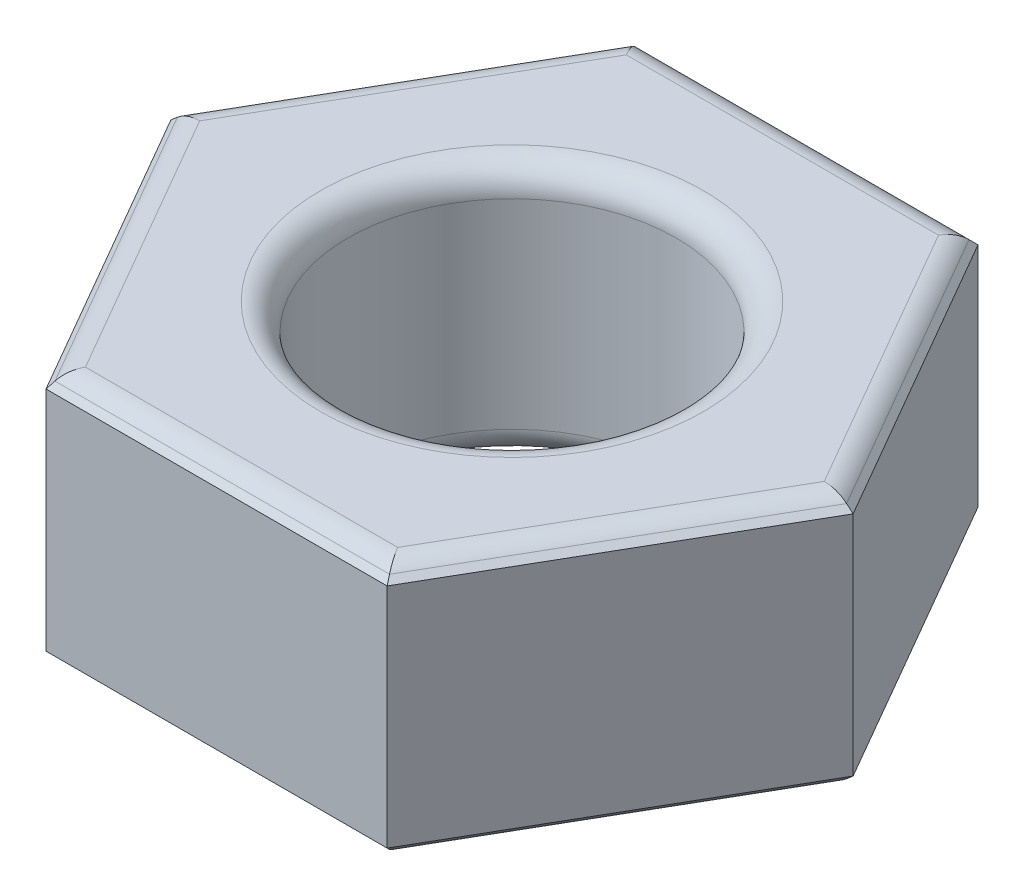
ISO-10303-21;
HEADER;
FILE_DESCRIPTION(('STEP AP214'),'2;1');
FILE_NAME('part.step','',(''),(''),'','','');
FILE_SCHEMA(('AUTOMOTIVE_DESIGN { 1 0 10303 214 1 1 1 1 }'));
ENDSEC;
DATA;
#1=APPLICATION_CONTEXT('core data for automotive mechanical design processes');
#2=APPLICATION_PROTOCOL_DEFINITION('international standard','automotive_design',2000,#1);
#3=PRODUCT_CONTEXT('',#1,'mechanical');
#4=PRODUCT('Part','Part','',(#3));
#5=PRODUCT_RELATED_PRODUCT_CATEGORY('part','',(#4));
#6=PRODUCT_DEFINITION_FORMATION('','',#4);
#7=PRODUCT_DEFINITION_CONTEXT('part definition',#1,'design');
#8=PRODUCT_DEFINITION('design','',#6,#7);
#9=PRODUCT_DEFINITION_SHAPE('','',#8);
#10=(LENGTH_UNIT() NAMED_UNIT(*) SI_UNIT(.MILLI.,.METRE.));
#11=(NAMED_UNIT(*) PLANE_ANGLE_UNIT() SI_UNIT($,.RADIAN.));
#12=(NAMED_UNIT(*) SI_UNIT($,.STERADIAN.) SOLID_ANGLE_UNIT());
#13=UNCERTAINTY_MEASURE_WITH_UNIT(LENGTH_MEASURE(1.E-05),#10,'distance_accuracy_value','');
#14=(GEOMETRIC_REPRESENTATION_CONTEXT(3) GLOBAL_UNCERTAINTY_ASSIGNED_CONTEXT((#13)) GLOBAL_UNIT_ASSIGNED_CONTEXT((#10,
#11,#12)) REPRESENTATION_CONTEXT('',''));
#15=CARTESIAN_POINT('',(0.,0.,0.));
#16=DIRECTION('',(0.,0.,1.));
#17=DIRECTION('',(1.,0.,0.));
#18=AXIS2_PLACEMENT_3D('',#15,#16,#17);
#19=CARTESIAN_POINT('',(0.,2.325,0.));
#20=DIRECTION('',(0.,1.,0.));
#21=DIRECTION('',(0.,0.,1.));
#22=AXIS2_PLACEMENT_3D('',#19,#20,#21);
#23=PLANE('',#22);
#24=CARTESIAN_POINT('',(0.,2.325,0.));
#25=DIRECTION('',(0.,1.,0.));
#26=DIRECTION('',(0.,0.,1.));
#27=AXIS2_PLACEMENT_3D('',#24,#25,#26);
#28=CIRCLE('',#27,1.75);
#29=CARTESIAN_POINT('',(0.,2.325,1.75));
#30=VERTEX_POINT('',#29);
#31=EDGE_CURVE('E276',#30,#30,#28,.F.);
#32=ORIENTED_EDGE('',*,*,#31,.T.);
#33=EDGE_LOOP('',(#32));
#34=FACE_BOUND('',#33,.T.);
#35=DIRECTION('',(-1.,0.,0.));
#36=VECTOR('',#35,1.);
#37=CARTESIAN_POINT('',(0.,2.325,-2.47144660940673));
#38=LINE('',#37,#36);
#39=CARTESIAN_POINT('',(1.42689036522876,2.325,-2.47144660940673));
#40=VERTEX_POINT('',#39);
#41=CARTESIAN_POINT('',(-1.42689036522877,2.325,-2.47144660940672));
#42=VERTEX_POINT('',#41);
#43=EDGE_CURVE('E271',#40,#42,#38,.T.);
#44=ORIENTED_EDGE('',*,*,#43,.T.);
#45=DIRECTION('',(-0.499999999999995,0.,0.866025403784442));
#46=VECTOR('',#45,1.);
#47=CARTESIAN_POINT('',(-2.14033554784315,2.325,-1.23572330470335));
#48=LINE('',#47,#46);
#49=CARTESIAN_POINT('',(-2.85378073045753,2.325,0.));
#50=VERTEX_POINT('',#49);
#51=EDGE_CURVE('E273',#42,#50,#48,.T.);
#52=ORIENTED_EDGE('',*,*,#51,.T.);
#53=DIRECTION('',(0.500000000000007,0.,0.866025403784434));
#54=VECTOR('',#53,1.);
#55=CARTESIAN_POINT('',(-2.14033554784313,2.325,1.23572330470338));
#56=LINE('',#55,#54);
#57=CARTESIAN_POINT('',(-1.42689036522874,2.325,2.47144660940674));
#58=VERTEX_POINT('',#57);
#59=EDGE_CURVE('E263',#50,#58,#56,.T.);
#60=ORIENTED_EDGE('',*,*,#59,.T.);
#61=DIRECTION('',(1.,0.,0.));
#62=VECTOR('',#61,1.);
#63=CARTESIAN_POINT('',(0.,2.325,2.47144660940673));
#64=LINE('',#63,#62);
#65=CARTESIAN_POINT('',(1.42689036522879,2.325,2.47144660940671));
#66=VERTEX_POINT('',#65);
#67=EDGE_CURVE('E265',#58,#66,#64,.T.);
#68=ORIENTED_EDGE('',*,*,#67,.T.);
#69=DIRECTION('',(0.499999999999995,0.,-0.866025403784441));
#70=VECTOR('',#69,1.);
#71=CARTESIAN_POINT('',(2.14033554784316,2.325,1.23572330470336));
#72=LINE('',#71,#70);
#73=CARTESIAN_POINT('',(2.85378073045753,2.325,0.));
#74=VERTEX_POINT('',#73);
#75=EDGE_CURVE('E267',#66,#74,#72,.T.);
#76=ORIENTED_EDGE('',*,*,#75,.T.);
#77=DIRECTION('',(-0.500000000000001,0.,-0.866025403784438));
#78=VECTOR('',#77,1.);
#79=CARTESIAN_POINT('',(2.14033554784314,2.325,-1.23572330470337));
#80=LINE('',#79,#78);
#81=EDGE_CURVE('E269',#74,#40,#80,.T.);
#82=ORIENTED_EDGE('',*,*,#81,.T.);
#83=EDGE_LOOP('',(#44,#52,#60,#68,#76,#82));
#84=FACE_BOUND('',#83,.T.);
#85=ADVANCED_FACE('F43',(#34,#84),#23,.T.);
#86=CARTESIAN_POINT('',(0.,0.,0.));
#87=DIRECTION('',(0.,1.,0.));
#88=DIRECTION('',(0.,0.,1.));
#89=AXIS2_PLACEMENT_3D('',#86,#87,#88);
#90=PLANE('',#89);
#91=CARTESIAN_POINT('',(0.,0.,0.));
#92=DIRECTION('',(0.,1.,0.));
#93=DIRECTION('',(0.,0.,1.));
#94=AXIS2_PLACEMENT_3D('',#91,#92,#93);
#95=CIRCLE('',#94,1.75);
#96=CARTESIAN_POINT('',(0.,0.,1.75));
#97=VERTEX_POINT('',#96);
#98=EDGE_CURVE('E304',#97,#97,#95,.T.);
#99=ORIENTED_EDGE('',*,*,#98,.T.);
#100=EDGE_LOOP('',(#99));
#101=FACE_BOUND('',#100,.T.);
#102=DIRECTION('',(0.500000000000007,0.,0.866025403784434));
#103=VECTOR('',#102,1.);
#104=CARTESIAN_POINT('',(-2.88367401942479,0.,-0.0517766952966166));
#105=LINE('',#104,#103);
#106=CARTESIAN_POINT('',(-1.42689036522874,0.,2.47144660940674));
#107=VERTEX_POINT('',#106);
#108=CARTESIAN_POINT('',(-2.85378073045752,0.,0.));
#109=VERTEX_POINT('',#108);
#110=EDGE_CURVE('E299',#107,#109,#105,.F.);
#111=ORIENTED_EDGE('',*,*,#110,.T.);
#112=DIRECTION('',(-0.499999999999995,0.,0.866025403784442));
#113=VECTOR('',#112,1.);
#114=CARTESIAN_POINT('',(-1.39699707626151,0.,-2.52322330470336));
#115=LINE('',#114,#113);
#116=CARTESIAN_POINT('',(-1.42689036522877,0.,-2.47144660940672));
#117=VERTEX_POINT('',#116);
#118=EDGE_CURVE('E301',#109,#117,#115,.F.);
#119=ORIENTED_EDGE('',*,*,#118,.T.);
#120=DIRECTION('',(-1.,0.,0.));
#121=VECTOR('',#120,1.);
#122=CARTESIAN_POINT('',(1.48667694316328,0.,-2.47144660940673));
#123=LINE('',#122,#121);
#124=CARTESIAN_POINT('',(1.42689036522876,0.,-2.47144660940673));
#125=VERTEX_POINT('',#124);
#126=EDGE_CURVE('E291',#117,#125,#123,.F.);
#127=ORIENTED_EDGE('',*,*,#126,.T.);
#128=DIRECTION('',(-0.500000000000001,0.,-0.866025403784438));
#129=VECTOR('',#128,1.);
#130=CARTESIAN_POINT('',(2.88367401942479,0.,0.0517766952966374));
#131=LINE('',#130,#129);
#132=CARTESIAN_POINT('',(2.85378073045753,0.,0.));
#133=VERTEX_POINT('',#132);
#134=EDGE_CURVE('E293',#125,#133,#131,.F.);
#135=ORIENTED_EDGE('',*,*,#134,.T.);
#136=DIRECTION('',(0.499999999999995,0.,-0.866025403784441));
#137=VECTOR('',#136,1.);
#138=CARTESIAN_POINT('',(1.39699707626153,0.,2.52322330470335));
#139=LINE('',#138,#137);
#140=CARTESIAN_POINT('',(1.42689036522879,0.,2.47144660940671));
#141=VERTEX_POINT('',#140);
#142=EDGE_CURVE('E295',#133,#141,#139,.F.);
#143=ORIENTED_EDGE('',*,*,#142,.T.);
#144=DIRECTION('',(1.,0.,0.));
#145=VECTOR('',#144,1.);
#146=CARTESIAN_POINT('',(-1.48667694316326,0.,2.47144660940674));
#147=LINE('',#146,#145);
#148=EDGE_CURVE('E297',#141,#107,#147,.F.);
#149=ORIENTED_EDGE('',*,*,#148,.T.);
#150=EDGE_LOOP('',(#111,#119,#127,#135,#143,#149));
#151=FACE_BOUND('',#150,.T.);
#152=ADVANCED_FACE('F460',(#101,#151),#90,.F.);
#153=CARTESIAN_POINT('',(1.55884572681202,2.325,2.69999999999998));
#154=DIRECTION('',(-0.866025403784441,0.,-0.499999999999995));
#155=DIRECTION('',(-0.499999999999995,0.,0.866025403784441));
#156=AXIS2_PLACEMENT_3D('',#153,#154,#155);
#157=PLANE('',#156);
#158=DIRECTION('',(0.,-1.,0.));
#159=VECTOR('',#158,1.);
#160=CARTESIAN_POINT('',(1.55884572681202,2.325,2.69999999999998));
#161=LINE('',#160,#159);
#162=CARTESIAN_POINT('',(1.55884572681202,2.2,2.69999999999998));
#163=VERTEX_POINT('',#162);
#164=CARTESIAN_POINT('',(1.55884572681202,0.125,2.69999999999998));
#165=VERTEX_POINT('',#164);
#166=EDGE_CURVE('E248',#163,#165,#161,.T.);
#167=ORIENTED_EDGE('',*,*,#166,.T.);
#168=DIRECTION('',(0.499999999999995,0.,-0.866025403784441));
#169=VECTOR('',#168,1.);
#170=CARTESIAN_POINT('',(1.55884572681202,0.125,2.69999999999998));
#171=LINE('',#170,#169);
#172=CARTESIAN_POINT('',(3.11769145362398,0.125,0.));
#173=VERTEX_POINT('',#172);
#174=EDGE_CURVE('E222',#165,#173,#171,.T.);
#175=ORIENTED_EDGE('',*,*,#174,.T.);
#176=DIRECTION('',(0.,-1.,0.));
#177=VECTOR('',#176,1.);
#178=CARTESIAN_POINT('',(3.11769145362398,2.325,0.));
#179=LINE('',#178,#177);
#180=CARTESIAN_POINT('',(3.11769145362398,2.2,0.));
#181=VERTEX_POINT('',#180);
#182=EDGE_CURVE('E192',#181,#173,#179,.T.);
#183=ORIENTED_EDGE('',*,*,#182,.F.);
#184=DIRECTION('',(-0.499999999999995,0.,0.866025403784441));
#185=VECTOR('',#184,1.);
#186=CARTESIAN_POINT('',(1.55884572681202,2.2,2.69999999999998));
#187=LINE('',#186,#185);
#188=EDGE_CURVE('E220',#181,#163,#187,.T.);
#189=ORIENTED_EDGE('',*,*,#188,.T.);
#190=EDGE_LOOP('',(#167,#175,#183,#189));
#191=FACE_BOUND('',#190,.T.);
#192=ADVANCED_FACE('F396',(#191),#157,.F.);
#193=CARTESIAN_POINT('',(3.11769145362398,2.325,0.));
#194=DIRECTION('',(-0.866025403784438,0.,0.500000000000001));
#195=DIRECTION('',(0.500000000000001,0.,0.866025403784438));
#196=AXIS2_PLACEMENT_3D('',#193,#194,#195);
#197=PLANE('',#196);
#198=ORIENTED_EDGE('',*,*,#182,.T.);
#199=DIRECTION('',(-0.500000000000001,0.,-0.866025403784438));
#200=VECTOR('',#199,1.);
#201=CARTESIAN_POINT('',(3.11769145362398,0.125,0.));
#202=LINE('',#201,#200);
#203=CARTESIAN_POINT('',(1.55884572681198,0.125,-2.70000000000001));
#204=VERTEX_POINT('',#203);
#205=EDGE_CURVE('E182',#173,#204,#202,.T.);
#206=ORIENTED_EDGE('',*,*,#205,.T.);
#207=DIRECTION('',(0.,-1.,0.));
#208=VECTOR('',#207,1.);
#209=CARTESIAN_POINT('',(1.55884572681198,2.325,-2.70000000000001));
#210=LINE('',#209,#208);
#211=CARTESIAN_POINT('',(1.55884572681198,2.2,-2.70000000000001));
#212=VERTEX_POINT('',#211);
#213=EDGE_CURVE('E175',#212,#204,#210,.T.);
#214=ORIENTED_EDGE('',*,*,#213,.F.);
#215=DIRECTION('',(0.500000000000001,0.,0.866025403784438));
#216=VECTOR('',#215,1.);
#217=CARTESIAN_POINT('',(3.11769145362398,2.2,0.));
#218=LINE('',#217,#216);
#219=EDGE_CURVE('E189',#212,#181,#218,.T.);
#220=ORIENTED_EDGE('',*,*,#219,.T.);
#221=EDGE_LOOP('',(#198,#206,#214,#220));
#222=FACE_BOUND('',#221,.T.);
#223=ADVANCED_FACE('F187',(#222),#197,.F.);
#224=CARTESIAN_POINT('',(1.55884572681198,2.325,-2.70000000000001));
#225=DIRECTION('',(0.,0.,1.));
#226=DIRECTION('',(1.,0.,0.));
#227=AXIS2_PLACEMENT_3D('',#224,#225,#226);
#228=PLANE('',#227);
#229=ORIENTED_EDGE('',*,*,#213,.T.);
#230=DIRECTION('',(-1.,0.,0.));
#231=VECTOR('',#230,1.);
#232=CARTESIAN_POINT('',(1.55884572681198,0.125,-2.70000000000001));
#233=LINE('',#232,#231);
#234=CARTESIAN_POINT('',(-1.558845726812,0.125,-2.7));
#235=VERTEX_POINT('',#234);
#236=EDGE_CURVE('E181',#204,#235,#233,.T.);
#237=ORIENTED_EDGE('',*,*,#236,.T.);
#238=DIRECTION('',(0.,-1.,0.));
#239=VECTOR('',#238,1.);
#240=CARTESIAN_POINT('',(-1.558845726812,2.325,-2.7));
#241=LINE('',#240,#239);
#242=CARTESIAN_POINT('',(-1.558845726812,2.2,-2.7));
#243=VERTEX_POINT('',#242);
#244=EDGE_CURVE('E177',#243,#235,#241,.T.);
#245=ORIENTED_EDGE('',*,*,#244,.F.);
#246=DIRECTION('',(1.,0.,0.));
#247=VECTOR('',#246,1.);
#248=CARTESIAN_POINT('',(1.55884572681198,2.2,-2.70000000000001));
#249=LINE('',#248,#247);
#250=EDGE_CURVE('E171',#243,#212,#249,.T.);
#251=ORIENTED_EDGE('',*,*,#250,.T.);
#252=EDGE_LOOP('',(#229,#237,#245,#251));
#253=FACE_BOUND('',#252,.T.);
#254=ADVANCED_FACE('F173',(#253),#228,.F.);
#255=CARTESIAN_POINT('',(-1.558845726812,2.325,-2.7));
#256=DIRECTION('',(0.866025403784442,0.,0.499999999999995));
#257=DIRECTION('',(0.499999999999995,0.,-0.866025403784442));
#258=AXIS2_PLACEMENT_3D('',#255,#256,#257);
#259=PLANE('',#258);
#260=ORIENTED_EDGE('',*,*,#244,.T.);
#261=DIRECTION('',(-0.499999999999995,0.,0.866025403784442));
#262=VECTOR('',#261,1.);
#263=CARTESIAN_POINT('',(-1.558845726812,0.125,-2.7));
#264=LINE('',#263,#262);
#265=CARTESIAN_POINT('',(-3.11769145362398,0.125000000000001,0.));
#266=VERTEX_POINT('',#265);
#267=EDGE_CURVE('E217',#235,#266,#264,.T.);
#268=ORIENTED_EDGE('',*,*,#267,.T.);
#269=DIRECTION('',(0.,-1.,0.));
#270=VECTOR('',#269,1.);
#271=CARTESIAN_POINT('',(-3.11769145362398,2.325,0.));
#272=LINE('',#271,#270);
#273=CARTESIAN_POINT('',(-3.11769145362398,2.2,0.));
#274=VERTEX_POINT('',#273);
#275=EDGE_CURVE('E398',#274,#266,#272,.T.);
#276=ORIENTED_EDGE('',*,*,#275,.F.);
#277=DIRECTION('',(0.499999999999995,0.,-0.866025403784442));
#278=VECTOR('',#277,1.);
#279=CARTESIAN_POINT('',(-1.558845726812,2.2,-2.7));
#280=LINE('',#279,#278);
#281=EDGE_CURVE('E214',#274,#243,#280,.T.);
#282=ORIENTED_EDGE('',*,*,#281,.T.);
#283=EDGE_LOOP('',(#260,#268,#276,#282));
#284=FACE_BOUND('',#283,.T.);
#285=ADVANCED_FACE('F404',(#284),#259,.F.);
#286=CARTESIAN_POINT('',(-3.11769145362398,2.325,0.));
#287=DIRECTION('',(0.866025403784435,0.,-0.500000000000007));
#288=DIRECTION('',(-0.500000000000007,0.,-0.866025403784435));
#289=AXIS2_PLACEMENT_3D('',#286,#287,#288);
#290=PLANE('',#289);
#291=ORIENTED_EDGE('',*,*,#275,.T.);
#292=DIRECTION('',(0.500000000000007,0.,0.866025403784435));
#293=VECTOR('',#292,1.);
#294=CARTESIAN_POINT('',(-3.11769145362398,0.125000000000001,0.));
#295=LINE('',#294,#293);
#296=CARTESIAN_POINT('',(-1.55884572681197,0.125000000000001,2.70000000000002));
#297=VERTEX_POINT('',#296);
#298=EDGE_CURVE('E232',#266,#297,#295,.T.);
#299=ORIENTED_EDGE('',*,*,#298,.T.);
#300=DIRECTION('',(0.,-1.,0.));
#301=VECTOR('',#300,1.);
#302=CARTESIAN_POINT('',(-1.55884572681197,2.325,2.70000000000002));
#303=LINE('',#302,#301);
#304=CARTESIAN_POINT('',(-1.55884572681197,2.2,2.70000000000002));
#305=VERTEX_POINT('',#304);
#306=EDGE_CURVE('E394',#305,#297,#303,.T.);
#307=ORIENTED_EDGE('',*,*,#306,.F.);
#308=DIRECTION('',(-0.500000000000007,0.,-0.866025403784435));
#309=VECTOR('',#308,1.);
#310=CARTESIAN_POINT('',(-3.11769145362398,2.2,0.));
#311=LINE('',#310,#309);
#312=EDGE_CURVE('E229',#305,#274,#311,.T.);
#313=ORIENTED_EDGE('',*,*,#312,.T.);
#314=EDGE_LOOP('',(#291,#299,#307,#313));
#315=FACE_BOUND('',#314,.T.);
#316=ADVANCED_FACE('F449',(#315),#290,.F.);
#317=CARTESIAN_POINT('',(-1.55884572681197,2.325,2.70000000000002));
#318=DIRECTION('',(0.,0.,-1.));
#319=DIRECTION('',(-1.,0.,0.));
#320=AXIS2_PLACEMENT_3D('',#317,#318,#319);
#321=PLANE('',#320);
#322=ORIENTED_EDGE('',*,*,#306,.T.);
#323=DIRECTION('',(1.,0.,0.));
#324=VECTOR('',#323,1.);
#325=CARTESIAN_POINT('',(-1.55884572681197,0.125,2.70000000000002));
#326=LINE('',#325,#324);
#327=EDGE_CURVE('E227',#297,#165,#326,.T.);
#328=ORIENTED_EDGE('',*,*,#327,.T.);
#329=ORIENTED_EDGE('',*,*,#166,.F.);
#330=DIRECTION('',(-1.,0.,0.));
#331=VECTOR('',#330,1.);
#332=CARTESIAN_POINT('',(-1.55884572681197,2.2,2.70000000000002));
#333=LINE('',#332,#331);
#334=EDGE_CURVE('E224',#163,#305,#333,.T.);
#335=ORIENTED_EDGE('',*,*,#334,.T.);
#336=EDGE_LOOP('',(#322,#328,#329,#335));
#337=FACE_BOUND('',#336,.T.);
#338=ADVANCED_FACE('F391',(#337),#321,.F.);
#339=CARTESIAN_POINT('',(0.,2.325,0.));
#340=DIRECTION('',(0.,-1.,0.));
#341=DIRECTION('',(0.,0.,-1.));
#342=AXIS2_PLACEMENT_3D('',#339,#340,#341);
#343=CYLINDRICAL_SURFACE('',#342,1.5);
#344=CARTESIAN_POINT('',(0.,2.075,0.));
#345=DIRECTION('',(0.,1.,0.));
#346=DIRECTION('',(0.,0.,1.));
#347=AXIS2_PLACEMENT_3D('',#344,#345,#346);
#348=CIRCLE('',#347,1.5);
#349=CARTESIAN_POINT('',(0.,2.075,1.5));
#350=VERTEX_POINT('',#349);
#351=EDGE_CURVE('E260',#350,#350,#348,.T.);
#352=ORIENTED_EDGE('',*,*,#351,.T.);
#353=EDGE_LOOP('',(#352));
#354=FACE_BOUND('',#353,.T.);
#355=CARTESIAN_POINT('',(0.,0.25,0.));
#356=DIRECTION('',(0.,1.,0.));
#357=DIRECTION('',(0.,0.,1.));
#358=AXIS2_PLACEMENT_3D('',#355,#356,#357);
#359=CIRCLE('',#358,1.5);
#360=CARTESIAN_POINT('',(0.,0.25,1.5));
#361=VERTEX_POINT('',#360);
#362=EDGE_CURVE('E234',#361,#361,#359,.F.);
#363=ORIENTED_EDGE('',*,*,#362,.T.);
#364=EDGE_LOOP('',(#363));
#365=FACE_BOUND('',#364,.T.);
#366=ADVANCED_FACE('F456',(#354,#365),#343,.F.);
#367=CARTESIAN_POINT('',(-3.11769145362398,0.125,0.));
#368=DIRECTION('',(0.612372435695788,0.707106781186551,-0.353553390593277));
#369=DIRECTION('',(0.500000000000007,0.,0.866025403784435));
#370=AXIS2_PLACEMENT_3D('',#367,#368,#369);
#371=PLANE('',#370);
#372=DIRECTION('',(0.755928946018457,-0.654653670707974,0.));
#373=VECTOR('',#372,1.);
#374=CARTESIAN_POINT('',(-3.11769145362398,0.125,0.));
#375=LINE('',#374,#373);
#376=CARTESIAN_POINT('',(-3.05790487568945,0.0732233047033621,0.));
#377=VERTEX_POINT('',#376);
#378=EDGE_CURVE('E243',#377,#266,#375,.F.);
#379=ORIENTED_EDGE('',*,*,#378,.F.);
#380=DIRECTION('',(-0.500000000000007,0.,-0.866025403784435));
#381=VECTOR('',#380,1.);
#382=CARTESIAN_POINT('',(-1.55009018518542,0.0732233047033623,2.6116116523517));
#383=LINE('',#382,#381);
#384=CARTESIAN_POINT('',(-1.5289524378447,0.0732233047033628,2.64822330470338));
#385=VERTEX_POINT('',#384);
#386=EDGE_CURVE('E310',#377,#385,#383,.F.);
#387=ORIENTED_EDGE('',*,*,#386,.T.);
#388=DIRECTION('',(-0.377964473009227,0.654653670707975,0.65465367070798));
#389=VECTOR('',#388,1.);
#390=CARTESIAN_POINT('',(-1.11346123343711,-0.646428571428564,1.92857142857145));
#391=LINE('',#390,#389);
#392=EDGE_CURVE('E245',#297,#385,#391,.F.);
#393=ORIENTED_EDGE('',*,*,#392,.F.);
#394=ORIENTED_EDGE('',*,*,#298,.F.);
#395=EDGE_LOOP('',(#379,#387,#393,#394));
#396=FACE_BOUND('',#395,.T.);
#397=ADVANCED_FACE('F380',(#396),#371,.F.);
#398=CARTESIAN_POINT('',(-1.55884572681197,0.125,2.70000000000002));
#399=DIRECTION('',(0.,0.707106781186548,-0.707106781186547));
#400=DIRECTION('',(1.,0.,0.));
#401=AXIS2_PLACEMENT_3D('',#398,#399,#400);
#402=PLANE('',#401);
#403=ORIENTED_EDGE('',*,*,#392,.T.);
#404=DIRECTION('',(-1.,0.,0.));
#405=VECTOR('',#404,1.);
#406=CARTESIAN_POINT('',(1.48667694316332,0.0732233047033629,2.64822330470335));
#407=LINE('',#406,#405);
#408=CARTESIAN_POINT('',(1.52895243784476,0.0732233047033626,2.64822330470335));
#409=VERTEX_POINT('',#408);
#410=EDGE_CURVE('E312',#385,#409,#407,.F.);
#411=ORIENTED_EDGE('',*,*,#410,.T.);
#412=DIRECTION('',(0.377964473009235,0.654653670707976,0.654653670707973));
#413=VECTOR('',#412,1.);
#414=CARTESIAN_POINT('',(1.11346123343716,-0.646428571428575,1.92857142857141));
#415=LINE('',#414,#413);
#416=EDGE_CURVE('E241',#165,#409,#415,.F.);
#417=ORIENTED_EDGE('',*,*,#416,.F.);
#418=ORIENTED_EDGE('',*,*,#327,.F.);
#419=EDGE_LOOP('',(#403,#411,#417,#418));
#420=FACE_BOUND('',#419,.T.);
#421=ADVANCED_FACE('F384',(#420),#402,.F.);
#422=CARTESIAN_POINT('',(-1.558845726812,0.125,-2.7));
#423=DIRECTION('',(0.612372435695795,0.707106781186549,0.353553390593269));
#424=DIRECTION('',(-0.499999999999995,0.,0.866025403784442));
#425=AXIS2_PLACEMENT_3D('',#422,#423,#424);
#426=PLANE('',#425);
#427=DIRECTION('',(0.377964473009231,-0.654653670707975,0.654653670707977));
#428=VECTOR('',#427,1.);
#429=CARTESIAN_POINT('',(-1.558845726812,0.125,-2.7));
#430=LINE('',#429,#428);
#431=CARTESIAN_POINT('',(-1.52895243784474,0.0732233047033628,-2.64822330470336));
#432=VERTEX_POINT('',#431);
#433=EDGE_CURVE('E239',#432,#235,#430,.F.);
#434=ORIENTED_EDGE('',*,*,#433,.F.);
#435=DIRECTION('',(0.499999999999995,0.,-0.866025403784442));
#436=VECTOR('',#435,1.);
#437=CARTESIAN_POINT('',(-3.03676712834873,0.0732233047033629,-0.0366116523516609));
#438=LINE('',#437,#436);
#439=EDGE_CURVE('E307',#432,#377,#438,.F.);
#440=ORIENTED_EDGE('',*,*,#439,.T.);
#441=ORIENTED_EDGE('',*,*,#378,.T.);
#442=ORIENTED_EDGE('',*,*,#267,.F.);
#443=EDGE_LOOP('',(#434,#440,#441,#442));
#444=FACE_BOUND('',#443,.T.);
#445=ADVANCED_FACE('F368',(#444),#426,.F.);
#446=CARTESIAN_POINT('',(1.55884572681202,0.125,2.69999999999998));
#447=DIRECTION('',(-0.612372435695795,0.70710678118655,-0.353553390593269));
#448=DIRECTION('',(0.499999999999995,0.,-0.866025403784441));
#449=AXIS2_PLACEMENT_3D('',#446,#447,#448);
#450=PLANE('',#449);
#451=ORIENTED_EDGE('',*,*,#416,.T.);
#452=DIRECTION('',(-0.499999999999995,0.,0.866025403784441));
#453=VECTOR('',#452,1.);
#454=CARTESIAN_POINT('',(3.03676712834874,0.0732233047033627,0.0366116523516818));
#455=LINE('',#454,#453);
#456=CARTESIAN_POINT('',(3.05790487568946,0.0732233047033625,0.));
#457=VERTEX_POINT('',#456);
#458=EDGE_CURVE('E67',#409,#457,#455,.F.);
#459=ORIENTED_EDGE('',*,*,#458,.T.);
#460=DIRECTION('',(0.755928946018456,0.654653670707975,0.));
#461=VECTOR('',#460,1.);
#462=CARTESIAN_POINT('',(2.22692246687428,-0.646428571428563,0.));
#463=LINE('',#462,#461);
#464=EDGE_CURVE('E237',#173,#457,#463,.F.);
#465=ORIENTED_EDGE('',*,*,#464,.F.);
#466=ORIENTED_EDGE('',*,*,#174,.F.);
#467=EDGE_LOOP('',(#451,#459,#465,#466));
#468=FACE_BOUND('',#467,.T.);
#469=ADVANCED_FACE('F643',(#468),#450,.F.);
#470=CARTESIAN_POINT('',(1.55884572681198,0.125,-2.70000000000001));
#471=DIRECTION('',(0.,0.707106781186549,0.707106781186546));
#472=DIRECTION('',(-1.,0.,0.));
#473=AXIS2_PLACEMENT_3D('',#470,#471,#472);
#474=PLANE('',#473);
#475=DIRECTION('',(-0.377964473009229,-0.654653670707974,0.654653670707979));
#476=VECTOR('',#475,1.);
#477=CARTESIAN_POINT('',(1.55884572681198,0.125,-2.70000000000001));
#478=LINE('',#477,#476);
#479=CARTESIAN_POINT('',(1.52895243784472,0.0732233047033626,-2.64822330470337));
#480=VERTEX_POINT('',#479);
#481=EDGE_CURVE('E235',#480,#204,#478,.F.);
#482=ORIENTED_EDGE('',*,*,#481,.F.);
#483=DIRECTION('',(1.,0.,0.));
#484=VECTOR('',#483,1.);
#485=CARTESIAN_POINT('',(-1.4866769431633,0.0732233047033627,-2.64822330470336));
#486=LINE('',#485,#484);
#487=EDGE_CURVE('E11',#480,#432,#486,.F.);
#488=ORIENTED_EDGE('',*,*,#487,.T.);
#489=ORIENTED_EDGE('',*,*,#433,.T.);
#490=ORIENTED_EDGE('',*,*,#236,.F.);
#491=EDGE_LOOP('',(#482,#488,#489,#490));
#492=FACE_BOUND('',#491,.T.);
#493=ADVANCED_FACE('F363',(#492),#474,.F.);
#494=CARTESIAN_POINT('',(3.11769145362398,0.125,0.));
#495=DIRECTION('',(-0.612372435695791,0.707106781186551,0.353553390593273));
#496=DIRECTION('',(-0.500000000000001,0.,-0.866025403784438));
#497=AXIS2_PLACEMENT_3D('',#494,#495,#496);
#498=PLANE('',#497);
#499=ORIENTED_EDGE('',*,*,#464,.T.);
#500=DIRECTION('',(0.500000000000001,0.,0.866025403784438));
#501=VECTOR('',#500,1.);
#502=CARTESIAN_POINT('',(1.55009018518544,0.0732233047033623,-2.61161165235169));
#503=LINE('',#502,#501);
#504=EDGE_CURVE('E52',#457,#480,#503,.F.);
#505=ORIENTED_EDGE('',*,*,#504,.T.);
#506=ORIENTED_EDGE('',*,*,#481,.T.);
#507=ORIENTED_EDGE('',*,*,#205,.F.);
#508=EDGE_LOOP('',(#499,#505,#506,#507));
#509=FACE_BOUND('',#508,.T.);
#510=ADVANCED_FACE('F628',(#509),#498,.F.);
#511=CARTESIAN_POINT('',(0.,2.325,-2.575));
#512=DIRECTION('',(0.,0.707106781186545,-0.707106781186551));
#513=DIRECTION('',(1.,0.,0.));
#514=AXIS2_PLACEMENT_3D('',#511,#512,#513);
#515=PLANE('',#514);
#516=DIRECTION('',(-0.377964473009229,-0.65465367070798,-0.654653670707973));
#517=VECTOR('',#516,1.);
#518=CARTESIAN_POINT('',(-1.2742945227114,2.69285714285715,-2.20714285714286));
#519=LINE('',#518,#517);
#520=CARTESIAN_POINT('',(-1.52895243784474,2.25177669529664,-2.64822330470336));
#521=VERTEX_POINT('',#520);
#522=EDGE_CURVE('E201',#521,#243,#519,.T.);
#523=ORIENTED_EDGE('',*,*,#522,.F.);
#524=DIRECTION('',(-1.,0.,0.));
#525=VECTOR('',#524,1.);
#526=CARTESIAN_POINT('',(0.,2.25177669529664,-2.64822330470337));
#527=LINE('',#526,#525);
#528=CARTESIAN_POINT('',(1.52895243784472,2.25177669529664,-2.64822330470337));
#529=VERTEX_POINT('',#528);
#530=EDGE_CURVE('E198',#521,#529,#527,.F.);
#531=ORIENTED_EDGE('',*,*,#530,.T.);
#532=DIRECTION('',(0.377964473009223,-0.654653670707981,-0.654653670707976));
#533=VECTOR('',#532,1.);
#534=CARTESIAN_POINT('',(1.27429452271139,2.69285714285714,-2.20714285714287));
#535=LINE('',#534,#533);
#536=EDGE_CURVE('E195',#212,#529,#535,.F.);
#537=ORIENTED_EDGE('',*,*,#536,.F.);
#538=ORIENTED_EDGE('',*,*,#250,.F.);
#539=EDGE_LOOP('',(#523,#531,#537,#538));
#540=FACE_BOUND('',#539,.T.);
#541=ADVANCED_FACE('F196',(#540),#515,.T.);
#542=CARTESIAN_POINT('',(-2.23001541474494,2.325,-1.28749999999999));
#543=DIRECTION('',(-0.612372435695799,0.707106781186545,-0.353553390593272));
#544=DIRECTION('',(0.499999999999995,0.,-0.866025403784442));
#545=AXIS2_PLACEMENT_3D('',#542,#543,#544);
#546=PLANE('',#545);
#547=DIRECTION('',(-0.755928946018452,-0.65465367070798,0.));
#548=VECTOR('',#547,1.);
#549=CARTESIAN_POINT('',(-2.54858904542278,2.69285714285715,0.));
#550=LINE('',#549,#548);
#551=CARTESIAN_POINT('',(-3.05790487568946,2.25177669529664,0.));
#552=VERTEX_POINT('',#551);
#553=EDGE_CURVE('E202',#552,#274,#550,.T.);
#554=ORIENTED_EDGE('',*,*,#553,.F.);
#555=DIRECTION('',(-0.499999999999995,0.,0.866025403784442));
#556=VECTOR('',#555,1.);
#557=CARTESIAN_POINT('',(-2.2934286567671,2.25177669529664,-1.32411165235167));
#558=LINE('',#557,#556);
#559=EDGE_CURVE('E279',#552,#521,#558,.F.);
#560=ORIENTED_EDGE('',*,*,#559,.T.);
#561=ORIENTED_EDGE('',*,*,#522,.T.);
#562=ORIENTED_EDGE('',*,*,#281,.F.);
#563=EDGE_LOOP('',(#554,#560,#561,#562));
#564=FACE_BOUND('',#563,.T.);
#565=ADVANCED_FACE('F409',(#564),#546,.T.);
#566=CARTESIAN_POINT('',(2.23001541474493,2.325,-1.2875));
#567=DIRECTION('',(0.612372435695797,0.707106781186543,-0.353553390593276));
#568=DIRECTION('',(0.500000000000001,0.,0.866025403784438));
#569=AXIS2_PLACEMENT_3D('',#566,#567,#568);
#570=PLANE('',#569);
#571=ORIENTED_EDGE('',*,*,#536,.T.);
#572=DIRECTION('',(-0.500000000000001,0.,-0.866025403784438));
#573=VECTOR('',#572,1.);
#574=CARTESIAN_POINT('',(2.29342865676709,2.25177669529664,-1.32411165235169));
#575=LINE('',#574,#573);
#576=CARTESIAN_POINT('',(3.05790487568946,2.25177669529664,0.));
#577=VERTEX_POINT('',#576);
#578=EDGE_CURVE('E283',#529,#577,#575,.F.);
#579=ORIENTED_EDGE('',*,*,#578,.T.);
#580=DIRECTION('',(0.755928946018451,-0.654653670707982,0.));
#581=VECTOR('',#580,1.);
#582=CARTESIAN_POINT('',(2.54858904542279,2.69285714285714,0.));
#583=LINE('',#582,#581);
#584=EDGE_CURVE('E207',#181,#577,#583,.F.);
#585=ORIENTED_EDGE('',*,*,#584,.F.);
#586=ORIENTED_EDGE('',*,*,#219,.F.);
#587=EDGE_LOOP('',(#571,#579,#585,#586));
#588=FACE_BOUND('',#587,.T.);
#589=ADVANCED_FACE('F205',(#588),#570,.T.);
#590=CARTESIAN_POINT('',(-2.23001541474492,2.325,1.28750000000002));
#591=DIRECTION('',(-0.612372435695795,0.707106781186544,0.353553390593281));
#592=DIRECTION('',(-0.500000000000007,0.,-0.866025403784435));
#593=AXIS2_PLACEMENT_3D('',#590,#591,#592);
#594=PLANE('',#593);
#595=DIRECTION('',(0.377964473009221,0.654653670707981,-0.654653670707977));
#596=VECTOR('',#595,1.);
#597=CARTESIAN_POINT('',(-1.27429452271137,2.69285714285714,2.20714285714288));
#598=LINE('',#597,#596);
#599=CARTESIAN_POINT('',(-1.5289524378447,2.25177669529664,2.64822330470338));
#600=VERTEX_POINT('',#599);
#601=EDGE_CURVE('E252',#600,#305,#598,.F.);
#602=ORIENTED_EDGE('',*,*,#601,.F.);
#603=DIRECTION('',(0.500000000000007,0.,0.866025403784434));
#604=VECTOR('',#603,1.);
#605=CARTESIAN_POINT('',(-2.29342865676708,2.25177669529664,1.3241116523517));
#606=LINE('',#605,#604);
#607=EDGE_CURVE('E289',#600,#552,#606,.F.);
#608=ORIENTED_EDGE('',*,*,#607,.T.);
#609=ORIENTED_EDGE('',*,*,#553,.T.);
#610=ORIENTED_EDGE('',*,*,#312,.F.);
#611=EDGE_LOOP('',(#602,#608,#609,#610));
#612=FACE_BOUND('',#611,.T.);
#613=ADVANCED_FACE('F447',(#612),#594,.T.);
#614=CARTESIAN_POINT('',(2.23001541474495,2.325,1.28749999999999));
#615=DIRECTION('',(0.6123724356958,0.707106781186544,0.353553390593272));
#616=DIRECTION('',(-0.499999999999995,0.,0.866025403784441));
#617=AXIS2_PLACEMENT_3D('',#614,#615,#616);
#618=PLANE('',#617);
#619=ORIENTED_EDGE('',*,*,#584,.T.);
#620=DIRECTION('',(0.499999999999995,0.,-0.866025403784441));
#621=VECTOR('',#620,1.);
#622=CARTESIAN_POINT('',(2.29342865676711,2.25177669529664,1.32411165235168));
#623=LINE('',#622,#621);
#624=CARTESIAN_POINT('',(1.52895243784476,2.25177669529664,2.64822330470335));
#625=VERTEX_POINT('',#624);
#626=EDGE_CURVE('E285',#577,#625,#623,.F.);
#627=ORIENTED_EDGE('',*,*,#626,.T.);
#628=DIRECTION('',(0.377964473009231,-0.654653670707982,0.65465367070797));
#629=VECTOR('',#628,1.);
#630=CARTESIAN_POINT('',(1.27429452271142,2.69285714285714,2.20714285714286));
#631=LINE('',#630,#629);
#632=EDGE_CURVE('E249',#163,#625,#631,.F.);
#633=ORIENTED_EDGE('',*,*,#632,.F.);
#634=ORIENTED_EDGE('',*,*,#188,.F.);
#635=EDGE_LOOP('',(#619,#627,#633,#634));
#636=FACE_BOUND('',#635,.T.);
#637=ADVANCED_FACE('F433',(#636),#618,.T.);
#638=CARTESIAN_POINT('',(0.,2.325,2.575));
#639=DIRECTION('',(0.,0.707106781186543,0.707106781186552));
#640=DIRECTION('',(-1.,0.,0.));
#641=AXIS2_PLACEMENT_3D('',#638,#639,#640);
#642=PLANE('',#641);
#643=ORIENTED_EDGE('',*,*,#632,.T.);
#644=DIRECTION('',(1.,0.,0.));
#645=VECTOR('',#644,1.);
#646=CARTESIAN_POINT('',(0.,2.25177669529664,2.64822330470337));
#647=LINE('',#646,#645);
#648=EDGE_CURVE('E287',#625,#600,#647,.F.);
#649=ORIENTED_EDGE('',*,*,#648,.T.);
#650=ORIENTED_EDGE('',*,*,#601,.T.);
#651=ORIENTED_EDGE('',*,*,#334,.F.);
#652=EDGE_LOOP('',(#643,#649,#650,#651));
#653=FACE_BOUND('',#652,.T.);
#654=ADVANCED_FACE('F444',(#653),#642,.T.);
#655=CARTESIAN_POINT('',(0.,2.075,0.));
#656=DIRECTION('',(0.,1.,0.));
#657=DIRECTION('',(0.,0.,1.));
#658=AXIS2_PLACEMENT_3D('',#655,#656,#657);
#659=TOROIDAL_SURFACE('',#658,1.75,0.25);
#660=ORIENTED_EDGE('',*,*,#31,.F.);
#661=EDGE_LOOP('',(#660));
#662=FACE_BOUND('',#661,.T.);
#663=ORIENTED_EDGE('',*,*,#351,.F.);
#664=EDGE_LOOP('',(#663));
#665=FACE_BOUND('',#664,.T.);
#666=ADVANCED_FACE('F578',(#662,#665),#659,.T.);
#667=CARTESIAN_POINT('',(2.14033554784316,2.075,1.23572330470336));
#668=DIRECTION('',(0.499999999999995,0.,-0.866025403784441));
#669=DIRECTION('',(-0.866025403784441,0.,-0.499999999999995));
#670=AXIS2_PLACEMENT_3D('',#667,#668,#669);
#671=CYLINDRICAL_SURFACE('',#670,0.25);
#672=CARTESIAN_POINT('',(1.42689036522879,2.075,2.47144660940671));
#673=DIRECTION('',(0.866025403784435,0.,-0.500000000000007));
#674=DIRECTION('',(0.500000000000007,0.,0.866025403784435));
#675=AXIS2_PLACEMENT_3D('',#672,#673,#674);
#676=ELLIPSE('',#675,0.288675134594813,0.25);
#677=EDGE_CURVE('E326',#625,#66,#676,.F.);
#678=ORIENTED_EDGE('',*,*,#677,.F.);
#679=ORIENTED_EDGE('',*,*,#626,.F.);
#680=CARTESIAN_POINT('',(2.85378073045753,2.075,0.));
#681=DIRECTION('',(0.,0.,-1.));
#682=DIRECTION('',(1.,0.,0.));
#683=AXIS2_PLACEMENT_3D('',#680,#681,#682);
#684=ELLIPSE('',#683,0.288675134594813,0.25);
#685=EDGE_CURVE('E253',#74,#577,#684,.T.);
#686=ORIENTED_EDGE('',*,*,#685,.F.);
#687=ORIENTED_EDGE('',*,*,#75,.F.);
#688=EDGE_LOOP('',(#678,#679,#686,#687));
#689=FACE_BOUND('',#688,.T.);
#690=ADVANCED_FACE('F437',(#689),#671,.T.);
#691=CARTESIAN_POINT('',(2.14033554784314,2.075,-1.23572330470337));
#692=DIRECTION('',(-0.500000000000001,0.,-0.866025403784438));
#693=DIRECTION('',(-0.866025403784438,0.,0.500000000000001));
#694=AXIS2_PLACEMENT_3D('',#691,#692,#693);
#695=CYLINDRICAL_SURFACE('',#694,0.25);
#696=ORIENTED_EDGE('',*,*,#685,.T.);
#697=ORIENTED_EDGE('',*,*,#578,.F.);
#698=CARTESIAN_POINT('',(1.42689036522876,2.075,-2.47144660940673));
#699=DIRECTION('',(-0.86602540378444,0.,-0.499999999999998));
#700=DIRECTION('',(0.499999999999998,0.,-0.86602540378444));
#701=AXIS2_PLACEMENT_3D('',#698,#699,#700);
#702=ELLIPSE('',#701,0.288675134594813,0.25);
#703=EDGE_CURVE('E323',#40,#529,#702,.T.);
#704=ORIENTED_EDGE('',*,*,#703,.F.);
#705=ORIENTED_EDGE('',*,*,#81,.F.);
#706=EDGE_LOOP('',(#696,#697,#704,#705));
#707=FACE_BOUND('',#706,.T.);
#708=ADVANCED_FACE('F429',(#707),#695,.T.);
#709=CARTESIAN_POINT('',(0.,2.075,2.47144660940673));
#710=DIRECTION('',(1.,0.,0.));
#711=DIRECTION('',(0.,0.,-1.));
#712=AXIS2_PLACEMENT_3D('',#709,#710,#711);
#713=CYLINDRICAL_SURFACE('',#712,0.25);
#714=ORIENTED_EDGE('',*,*,#677,.T.);
#715=ORIENTED_EDGE('',*,*,#67,.F.);
#716=CARTESIAN_POINT('',(-1.42689036522874,2.075,2.47144660940674));
#717=DIRECTION('',(0.866025403784443,0.,0.499999999999992));
#718=DIRECTION('',(-0.499999999999992,0.,0.866025403784443));
#719=AXIS2_PLACEMENT_3D('',#716,#717,#718);
#720=ELLIPSE('',#719,0.288675134594813,0.25);
#721=EDGE_CURVE('E320',#600,#58,#720,.F.);
#722=ORIENTED_EDGE('',*,*,#721,.F.);
#723=ORIENTED_EDGE('',*,*,#648,.F.);
#724=EDGE_LOOP('',(#714,#715,#722,#723));
#725=FACE_BOUND('',#724,.T.);
#726=ADVANCED_FACE('F441',(#725),#713,.T.);
#727=CARTESIAN_POINT('',(0.,2.075,-2.47144660940673));
#728=DIRECTION('',(-1.,0.,0.));
#729=DIRECTION('',(0.,0.,1.));
#730=AXIS2_PLACEMENT_3D('',#727,#728,#729);
#731=CYLINDRICAL_SURFACE('',#730,0.25);
#732=ORIENTED_EDGE('',*,*,#703,.T.);
#733=ORIENTED_EDGE('',*,*,#530,.F.);
#734=CARTESIAN_POINT('',(-1.42689036522877,2.075,-2.47144660940672));
#735=DIRECTION('',(-0.866025403784436,0.,0.500000000000004));
#736=DIRECTION('',(-0.500000000000004,0.,-0.866025403784436));
#737=AXIS2_PLACEMENT_3D('',#734,#735,#736);
#738=ELLIPSE('',#737,0.288675134594813,0.25);
#739=EDGE_CURVE('E318',#42,#521,#738,.T.);
#740=ORIENTED_EDGE('',*,*,#739,.F.);
#741=ORIENTED_EDGE('',*,*,#43,.F.);
#742=EDGE_LOOP('',(#732,#733,#740,#741));
#743=FACE_BOUND('',#742,.T.);
#744=ADVANCED_FACE('F427',(#743),#731,.T.);
#745=CARTESIAN_POINT('',(-2.14033554784313,2.075,1.23572330470338));
#746=DIRECTION('',(0.500000000000007,0.,0.866025403784434));
#747=DIRECTION('',(0.866025403784435,0.,-0.500000000000007));
#748=AXIS2_PLACEMENT_3D('',#745,#746,#747);
#749=CYLINDRICAL_SURFACE('',#748,0.25);
#750=ORIENTED_EDGE('',*,*,#721,.T.);
#751=ORIENTED_EDGE('',*,*,#59,.F.);
#752=CARTESIAN_POINT('',(-2.85378073045753,2.075,0.));
#753=DIRECTION('',(0.,0.,1.));
#754=DIRECTION('',(1.,0.,0.));
#755=AXIS2_PLACEMENT_3D('',#752,#753,#754);
#756=ELLIPSE('',#755,0.288675134594813,0.25);
#757=EDGE_CURVE('E316',#552,#50,#756,.F.);
#758=ORIENTED_EDGE('',*,*,#757,.F.);
#759=ORIENTED_EDGE('',*,*,#607,.F.);
#760=EDGE_LOOP('',(#750,#751,#758,#759));
#761=FACE_BOUND('',#760,.T.);
#762=ADVANCED_FACE('F419',(#761),#749,.T.);
#763=CARTESIAN_POINT('',(-2.14033554784315,2.075,-1.23572330470335));
#764=DIRECTION('',(-0.499999999999995,0.,0.866025403784442));
#765=DIRECTION('',(0.866025403784442,0.,0.499999999999995));
#766=AXIS2_PLACEMENT_3D('',#763,#764,#765);
#767=CYLINDRICAL_SURFACE('',#766,0.25);
#768=ORIENTED_EDGE('',*,*,#739,.T.);
#769=ORIENTED_EDGE('',*,*,#559,.F.);
#770=ORIENTED_EDGE('',*,*,#757,.T.);
#771=ORIENTED_EDGE('',*,*,#51,.F.);
#772=EDGE_LOOP('',(#768,#769,#770,#771));
#773=FACE_BOUND('',#772,.T.);
#774=ADVANCED_FACE('F413',(#773),#767,.T.);
#775=CARTESIAN_POINT('',(0.,0.25,0.));
#776=DIRECTION('',(0.,1.,0.));
#777=DIRECTION('',(0.,0.,1.));
#778=AXIS2_PLACEMENT_3D('',#775,#776,#777);
#779=TOROIDAL_SURFACE('',#778,1.75,0.25);
#780=ORIENTED_EDGE('',*,*,#362,.F.);
#781=EDGE_LOOP('',(#780));
#782=FACE_BOUND('',#781,.T.);
#783=ORIENTED_EDGE('',*,*,#98,.F.);
#784=EDGE_LOOP('',(#783));
#785=FACE_BOUND('',#784,.T.);
#786=ADVANCED_FACE('F479',(#782,#785),#779,.T.);
#787=CARTESIAN_POINT('',(2.14033554784316,0.25,1.23572330470336));
#788=DIRECTION('',(-0.499999999999995,0.,0.866025403784441));
#789=DIRECTION('',(0.866025403784441,0.,0.499999999999995));
#790=AXIS2_PLACEMENT_3D('',#787,#788,#789);
#791=CYLINDRICAL_SURFACE('',#790,0.25);
#792=CARTESIAN_POINT('',(2.85378073045753,0.25,0.));
#793=DIRECTION('',(0.,0.,1.));
#794=DIRECTION('',(1.,0.,0.));
#795=AXIS2_PLACEMENT_3D('',#792,#793,#794);
#796=ELLIPSE('',#795,0.288675134594813,0.25);
#797=EDGE_CURVE('E340',#457,#133,#796,.F.);
#798=ORIENTED_EDGE('',*,*,#797,.F.);
#799=ORIENTED_EDGE('',*,*,#458,.F.);
#800=CARTESIAN_POINT('',(1.42689036522879,0.25,2.47144660940671));
#801=DIRECTION('',(-0.866025403784435,0.,0.500000000000007));
#802=DIRECTION('',(0.500000000000007,0.,0.866025403784435));
#803=AXIS2_PLACEMENT_3D('',#800,#801,#802);
#804=ELLIPSE('',#803,0.288675134594813,0.25);
#805=EDGE_CURVE('E47',#141,#409,#804,.T.);
#806=ORIENTED_EDGE('',*,*,#805,.F.);
#807=ORIENTED_EDGE('',*,*,#142,.F.);
#808=EDGE_LOOP('',(#798,#799,#806,#807));
#809=FACE_BOUND('',#808,.T.);
#810=ADVANCED_FACE('F45',(#809),#791,.T.);
#811=CARTESIAN_POINT('',(0.,0.25,2.47144660940673));
#812=DIRECTION('',(-1.,0.,0.));
#813=DIRECTION('',(0.,0.,1.));
#814=AXIS2_PLACEMENT_3D('',#811,#812,#813);
#815=CYLINDRICAL_SURFACE('',#814,0.25);
#816=ORIENTED_EDGE('',*,*,#805,.T.);
#817=ORIENTED_EDGE('',*,*,#410,.F.);
#818=CARTESIAN_POINT('',(-1.42689036522874,0.25,2.47144660940674));
#819=DIRECTION('',(-0.866025403784443,0.,-0.499999999999992));
#820=DIRECTION('',(-0.499999999999992,0.,0.866025403784443));
#821=AXIS2_PLACEMENT_3D('',#818,#819,#820);
#822=ELLIPSE('',#821,0.288675134594813,0.25);
#823=EDGE_CURVE('E338',#107,#385,#822,.T.);
#824=ORIENTED_EDGE('',*,*,#823,.F.);
#825=ORIENTED_EDGE('',*,*,#148,.F.);
#826=EDGE_LOOP('',(#816,#817,#824,#825));
#827=FACE_BOUND('',#826,.T.);
#828=ADVANCED_FACE('F350',(#827),#815,.T.);
#829=CARTESIAN_POINT('',(2.14033554784314,0.25,-1.23572330470337));
#830=DIRECTION('',(0.500000000000001,0.,0.866025403784438));
#831=DIRECTION('',(0.866025403784438,0.,-0.500000000000001));
#832=AXIS2_PLACEMENT_3D('',#829,#830,#831);
#833=CYLINDRICAL_SURFACE('',#832,0.25);
#834=ORIENTED_EDGE('',*,*,#797,.T.);
#835=ORIENTED_EDGE('',*,*,#134,.F.);
#836=CARTESIAN_POINT('',(1.42689036522876,0.25,-2.47144660940673));
#837=DIRECTION('',(0.86602540378444,0.,0.499999999999998));
#838=DIRECTION('',(0.499999999999998,0.,-0.86602540378444));
#839=AXIS2_PLACEMENT_3D('',#836,#837,#838);
#840=ELLIPSE('',#839,0.288675134594813,0.25);
#841=EDGE_CURVE('E335',#480,#125,#840,.F.);
#842=ORIENTED_EDGE('',*,*,#841,.F.);
#843=ORIENTED_EDGE('',*,*,#504,.F.);
#844=EDGE_LOOP('',(#834,#835,#842,#843));
#845=FACE_BOUND('',#844,.T.);
#846=ADVANCED_FACE('F355',(#845),#833,.T.);
#847=CARTESIAN_POINT('',(-2.14033554784313,0.25,1.23572330470338));
#848=DIRECTION('',(-0.500000000000007,0.,-0.866025403784434));
#849=DIRECTION('',(-0.866025403784435,0.,0.500000000000007));
#850=AXIS2_PLACEMENT_3D('',#847,#848,#849);
#851=CYLINDRICAL_SURFACE('',#850,0.25);
#852=ORIENTED_EDGE('',*,*,#823,.T.);
#853=ORIENTED_EDGE('',*,*,#386,.F.);
#854=CARTESIAN_POINT('',(-2.85378073045752,0.25,0.));
#855=DIRECTION('',(0.,0.,-1.));
#856=DIRECTION('',(-1.,0.,0.));
#857=AXIS2_PLACEMENT_3D('',#854,#855,#856);
#858=ELLIPSE('',#857,0.288675134594813,0.25);
#859=EDGE_CURVE('E333',#109,#377,#858,.T.);
#860=ORIENTED_EDGE('',*,*,#859,.F.);
#861=ORIENTED_EDGE('',*,*,#110,.F.);
#862=EDGE_LOOP('',(#852,#853,#860,#861));
#863=FACE_BOUND('',#862,.T.);
#864=ADVANCED_FACE('F377',(#863),#851,.T.);
#865=CARTESIAN_POINT('',(0.,0.25,-2.47144660940673));
#866=DIRECTION('',(1.,0.,0.));
#867=DIRECTION('',(0.,0.,-1.));
#868=AXIS2_PLACEMENT_3D('',#865,#866,#867);
#869=CYLINDRICAL_SURFACE('',#868,0.25);
#870=ORIENTED_EDGE('',*,*,#841,.T.);
#871=ORIENTED_EDGE('',*,*,#126,.F.);
#872=CARTESIAN_POINT('',(-1.42689036522877,0.25,-2.47144660940672));
#873=DIRECTION('',(0.866025403784436,0.,-0.500000000000004));
#874=DIRECTION('',(0.500000000000004,0.,0.866025403784436));
#875=AXIS2_PLACEMENT_3D('',#872,#873,#874);
#876=ELLIPSE('',#875,0.288675134594813,0.25);
#877=EDGE_CURVE('E331',#432,#117,#876,.F.);
#878=ORIENTED_EDGE('',*,*,#877,.F.);
#879=ORIENTED_EDGE('',*,*,#487,.F.);
#880=EDGE_LOOP('',(#870,#871,#878,#879));
#881=FACE_BOUND('',#880,.T.);
#882=ADVANCED_FACE('F360',(#881),#869,.T.);
#883=CARTESIAN_POINT('',(-2.14033554784315,0.25,-1.23572330470335));
#884=DIRECTION('',(0.499999999999995,0.,-0.866025403784442));
#885=DIRECTION('',(-0.866025403784442,0.,-0.499999999999995));
#886=AXIS2_PLACEMENT_3D('',#883,#884,#885);
#887=CYLINDRICAL_SURFACE('',#886,0.25);
#888=ORIENTED_EDGE('',*,*,#859,.T.);
#889=ORIENTED_EDGE('',*,*,#439,.F.);
#890=ORIENTED_EDGE('',*,*,#877,.T.);
#891=ORIENTED_EDGE('',*,*,#118,.F.);
#892=EDGE_LOOP('',(#888,#889,#890,#891));
#893=FACE_BOUND('',#892,.T.);
#894=ADVANCED_FACE('F371',(#893),#887,.T.);
#895=CLOSED_SHELL('',(#85,#152,#192,#223,#254,#285,#316,#338,#366,#397,#421,#445,#469,#493,#510,
#541,#565,#589,#613,#637,#654,#666,#690,#708,#726,#744,#762,#774,#786,#810,#828,#846,#864,#882,#894));
#896=MANIFOLD_SOLID_BREP('B2',#895);
#897=ADVANCED_BREP_SHAPE_REPRESENTATION('',(#18,#896),#14);
#898=SHAPE_DEFINITION_REPRESENTATION(#9,#897);
ENDSEC;
END-ISO-10303-21;
